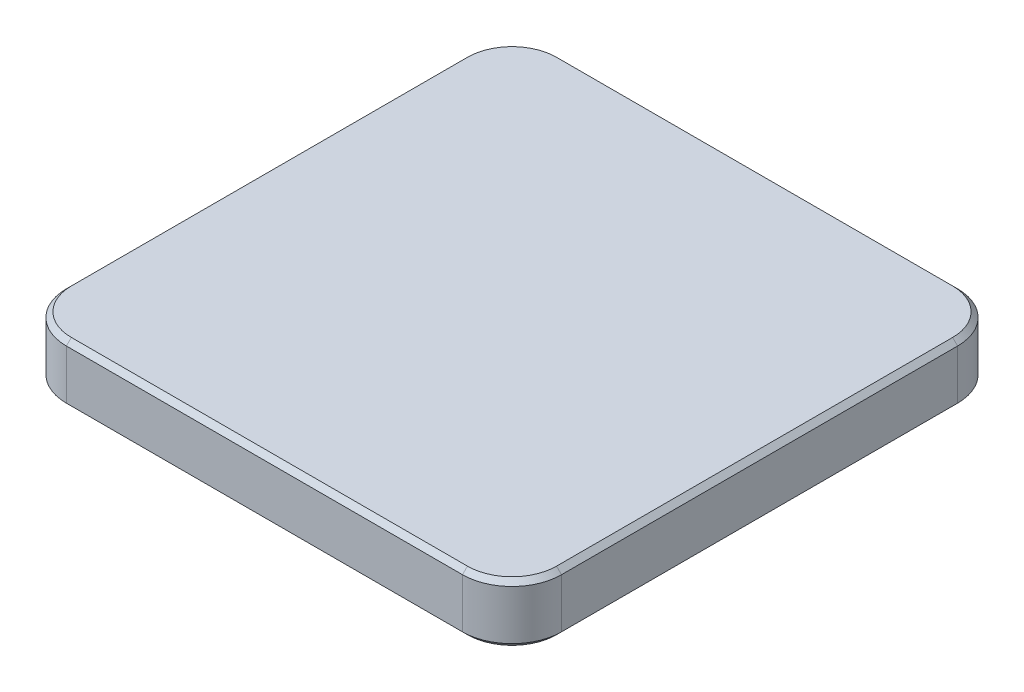
ISO-10303-21;
HEADER;
FILE_DESCRIPTION(('STEP AP214'),'2;1');
FILE_NAME('part.step','',(''),(''),'','','');
FILE_SCHEMA(('AUTOMOTIVE_DESIGN { 1 0 10303 214 1 1 1 1 }'));
ENDSEC;
DATA;
#1=APPLICATION_CONTEXT('core data for automotive mechanical design processes');
#2=APPLICATION_PROTOCOL_DEFINITION('international standard','automotive_design',2000,#1);
#3=PRODUCT_CONTEXT('',#1,'mechanical');
#4=PRODUCT('Part','Part','',(#3));
#5=PRODUCT_RELATED_PRODUCT_CATEGORY('part','',(#4));
#6=PRODUCT_DEFINITION_FORMATION('','',#4);
#7=PRODUCT_DEFINITION_CONTEXT('part definition',#1,'design');
#8=PRODUCT_DEFINITION('design','',#6,#7);
#9=PRODUCT_DEFINITION_SHAPE('','',#8);
#10=(LENGTH_UNIT() NAMED_UNIT(*) SI_UNIT(.MILLI.,.METRE.));
#11=(NAMED_UNIT(*) PLANE_ANGLE_UNIT() SI_UNIT($,.RADIAN.));
#12=(NAMED_UNIT(*) SI_UNIT($,.STERADIAN.) SOLID_ANGLE_UNIT());
#13=UNCERTAINTY_MEASURE_WITH_UNIT(LENGTH_MEASURE(1.E-05),#10,'distance_accuracy_value','');
#14=(GEOMETRIC_REPRESENTATION_CONTEXT(3) GLOBAL_UNCERTAINTY_ASSIGNED_CONTEXT((#13)) GLOBAL_UNIT_ASSIGNED_CONTEXT((#10,
#11,#12)) REPRESENTATION_CONTEXT('',''));
#15=CARTESIAN_POINT('',(0.,0.,0.));
#16=DIRECTION('',(0.,0.,1.));
#17=DIRECTION('',(1.,0.,0.));
#18=AXIS2_PLACEMENT_3D('',#15,#16,#17);
#19=CARTESIAN_POINT('',(-50.,12.,50.));
#20=DIRECTION('',(1.,0.,0.));
#21=DIRECTION('',(0.,0.,-1.));
#22=AXIS2_PLACEMENT_3D('',#19,#20,#21);
#23=PLANE('',#22);
#24=DIRECTION('',(0.,-1.,0.));
#25=VECTOR('',#24,1.);
#26=CARTESIAN_POINT('',(-50.,12.,40.));
#27=LINE('',#26,#25);
#28=CARTESIAN_POINT('',(-50.,1.,40.));
#29=VERTEX_POINT('',#28);
#30=CARTESIAN_POINT('',(-50.,11.,40.));
#31=VERTEX_POINT('',#30);
#32=EDGE_CURVE('E283',#29,#31,#27,.F.);
#33=ORIENTED_EDGE('',*,*,#32,.T.);
#34=DIRECTION('',(0.,0.,-1.));
#35=VECTOR('',#34,1.);
#36=CARTESIAN_POINT('',(-50.,11.,50.));
#37=LINE('',#36,#35);
#38=CARTESIAN_POINT('',(-50.,11.,-40.));
#39=VERTEX_POINT('',#38);
#40=EDGE_CURVE('E191',#31,#39,#37,.T.);
#41=ORIENTED_EDGE('',*,*,#40,.T.);
#42=DIRECTION('',(0.,-1.,0.));
#43=VECTOR('',#42,1.);
#44=CARTESIAN_POINT('',(-50.,12.,-40.));
#45=LINE('',#44,#43);
#46=CARTESIAN_POINT('',(-50.,1.,-40.));
#47=VERTEX_POINT('',#46);
#48=EDGE_CURVE('E275',#39,#47,#45,.T.);
#49=ORIENTED_EDGE('',*,*,#48,.T.);
#50=DIRECTION('',(0.,0.,1.));
#51=VECTOR('',#50,1.);
#52=CARTESIAN_POINT('',(-50.,1.,40.));
#53=LINE('',#52,#51);
#54=EDGE_CURVE('E189',#47,#29,#53,.T.);
#55=ORIENTED_EDGE('',*,*,#54,.T.);
#56=EDGE_LOOP('',(#33,#41,#49,#55));
#57=FACE_BOUND('',#56,.T.);
#58=ADVANCED_FACE('F33',(#57),#23,.F.);
#59=CARTESIAN_POINT('',(50.,12.,50.));
#60=DIRECTION('',(0.,0.,-1.));
#61=DIRECTION('',(-1.,0.,0.));
#62=AXIS2_PLACEMENT_3D('',#59,#60,#61);
#63=PLANE('',#62);
#64=DIRECTION('',(0.,-1.,0.));
#65=VECTOR('',#64,1.);
#66=CARTESIAN_POINT('',(40.,12.,50.));
#67=LINE('',#66,#65);
#68=CARTESIAN_POINT('',(40.,1.,50.));
#69=VERTEX_POINT('',#68);
#70=CARTESIAN_POINT('',(40.,11.,50.));
#71=VERTEX_POINT('',#70);
#72=EDGE_CURVE('E238',#69,#71,#67,.F.);
#73=ORIENTED_EDGE('',*,*,#72,.T.);
#74=DIRECTION('',(-1.,0.,0.));
#75=VECTOR('',#74,1.);
#76=CARTESIAN_POINT('',(50.,11.,50.));
#77=LINE('',#76,#75);
#78=CARTESIAN_POINT('',(-40.,11.,50.));
#79=VERTEX_POINT('',#78);
#80=EDGE_CURVE('E183',#71,#79,#77,.T.);
#81=ORIENTED_EDGE('',*,*,#80,.T.);
#82=DIRECTION('',(0.,-1.,0.));
#83=VECTOR('',#82,1.);
#84=CARTESIAN_POINT('',(-40.,12.,50.));
#85=LINE('',#84,#83);
#86=CARTESIAN_POINT('',(-40.,1.,50.));
#87=VERTEX_POINT('',#86);
#88=EDGE_CURVE('E284',#79,#87,#85,.T.);
#89=ORIENTED_EDGE('',*,*,#88,.T.);
#90=DIRECTION('',(1.,0.,0.));
#91=VECTOR('',#90,1.);
#92=CARTESIAN_POINT('',(40.,1.,50.));
#93=LINE('',#92,#91);
#94=EDGE_CURVE('E181',#87,#69,#93,.T.);
#95=ORIENTED_EDGE('',*,*,#94,.T.);
#96=EDGE_LOOP('',(#73,#81,#89,#95));
#97=FACE_BOUND('',#96,.T.);
#98=ADVANCED_FACE('F324',(#97),#63,.F.);
#99=CARTESIAN_POINT('',(50.,12.,-50.));
#100=DIRECTION('',(-1.,0.,0.));
#101=DIRECTION('',(0.,0.,1.));
#102=AXIS2_PLACEMENT_3D('',#99,#100,#101);
#103=PLANE('',#102);
#104=DIRECTION('',(0.,-1.,0.));
#105=VECTOR('',#104,1.);
#106=CARTESIAN_POINT('',(50.,12.,-40.));
#107=LINE('',#106,#105);
#108=CARTESIAN_POINT('',(50.,1.,-40.));
#109=VERTEX_POINT('',#108);
#110=CARTESIAN_POINT('',(50.,11.,-40.));
#111=VERTEX_POINT('',#110);
#112=EDGE_CURVE('E166',#109,#111,#107,.F.);
#113=ORIENTED_EDGE('',*,*,#112,.T.);
#114=DIRECTION('',(0.,0.,1.));
#115=VECTOR('',#114,1.);
#116=CARTESIAN_POINT('',(50.,11.,-50.));
#117=LINE('',#116,#115);
#118=CARTESIAN_POINT('',(50.,11.,40.));
#119=VERTEX_POINT('',#118);
#120=EDGE_CURVE('E207',#111,#119,#117,.T.);
#121=ORIENTED_EDGE('',*,*,#120,.T.);
#122=DIRECTION('',(0.,-1.,0.));
#123=VECTOR('',#122,1.);
#124=CARTESIAN_POINT('',(50.,12.,40.));
#125=LINE('',#124,#123);
#126=CARTESIAN_POINT('',(50.,1.,40.));
#127=VERTEX_POINT('',#126);
#128=EDGE_CURVE('E295',#119,#127,#125,.T.);
#129=ORIENTED_EDGE('',*,*,#128,.T.);
#130=DIRECTION('',(0.,0.,-1.));
#131=VECTOR('',#130,1.);
#132=CARTESIAN_POINT('',(50.,1.,-40.));
#133=LINE('',#132,#131);
#134=EDGE_CURVE('E205',#127,#109,#133,.T.);
#135=ORIENTED_EDGE('',*,*,#134,.T.);
#136=EDGE_LOOP('',(#113,#121,#129,#135));
#137=FACE_BOUND('',#136,.T.);
#138=ADVANCED_FACE('F336',(#137),#103,.F.);
#139=CARTESIAN_POINT('',(-50.,12.,-50.));
#140=DIRECTION('',(0.,0.,1.));
#141=DIRECTION('',(1.,0.,0.));
#142=AXIS2_PLACEMENT_3D('',#139,#140,#141);
#143=PLANE('',#142);
#144=DIRECTION('',(0.,-1.,0.));
#145=VECTOR('',#144,1.);
#146=CARTESIAN_POINT('',(-40.,12.,-50.));
#147=LINE('',#146,#145);
#148=CARTESIAN_POINT('',(-40.,1.,-50.));
#149=VERTEX_POINT('',#148);
#150=CARTESIAN_POINT('',(-40.,11.,-50.));
#151=VERTEX_POINT('',#150);
#152=EDGE_CURVE('E278',#149,#151,#147,.F.);
#153=ORIENTED_EDGE('',*,*,#152,.T.);
#154=DIRECTION('',(1.,0.,0.));
#155=VECTOR('',#154,1.);
#156=CARTESIAN_POINT('',(-50.,11.,-50.));
#157=LINE('',#156,#155);
#158=CARTESIAN_POINT('',(40.,11.,-50.));
#159=VERTEX_POINT('',#158);
#160=EDGE_CURVE('E199',#151,#159,#157,.T.);
#161=ORIENTED_EDGE('',*,*,#160,.T.);
#162=DIRECTION('',(0.,-1.,0.));
#163=VECTOR('',#162,1.);
#164=CARTESIAN_POINT('',(40.,12.,-50.));
#165=LINE('',#164,#163);
#166=CARTESIAN_POINT('',(40.,1.,-50.));
#167=VERTEX_POINT('',#166);
#168=EDGE_CURVE('E292',#159,#167,#165,.T.);
#169=ORIENTED_EDGE('',*,*,#168,.T.);
#170=DIRECTION('',(-1.,0.,0.));
#171=VECTOR('',#170,1.);
#172=CARTESIAN_POINT('',(-40.,1.,-50.));
#173=LINE('',#172,#171);
#174=EDGE_CURVE('E197',#167,#149,#173,.T.);
#175=ORIENTED_EDGE('',*,*,#174,.T.);
#176=EDGE_LOOP('',(#153,#161,#169,#175));
#177=FACE_BOUND('',#176,.T.);
#178=ADVANCED_FACE('F539',(#177),#143,.F.);
#179=CARTESIAN_POINT('',(0.,12.,0.));
#180=DIRECTION('',(0.,-1.,0.));
#181=DIRECTION('',(0.,0.,-1.));
#182=AXIS2_PLACEMENT_3D('',#179,#180,#181);
#183=PLANE('',#182);
#184=DIRECTION('',(1.,0.,0.));
#185=VECTOR('',#184,1.);
#186=CARTESIAN_POINT('',(0.,12.,49.));
#187=LINE('',#186,#185);
#188=CARTESIAN_POINT('',(-40.,12.,49.));
#189=VERTEX_POINT('',#188);
#190=CARTESIAN_POINT('',(40.,12.,49.));
#191=VERTEX_POINT('',#190);
#192=EDGE_CURVE('E170',#189,#191,#187,.T.);
#193=ORIENTED_EDGE('',*,*,#192,.T.);
#194=CARTESIAN_POINT('',(40.,12.,40.));
#195=DIRECTION('',(0.,-1.,0.));
#196=DIRECTION('',(0.,0.,-1.));
#197=AXIS2_PLACEMENT_3D('',#194,#195,#196);
#198=CIRCLE('',#197,9.00000000000003);
#199=CARTESIAN_POINT('',(49.,12.,40.));
#200=VERTEX_POINT('',#199);
#201=EDGE_CURVE('E151',#191,#200,#198,.F.);
#202=ORIENTED_EDGE('',*,*,#201,.T.);
#203=DIRECTION('',(0.,0.,-1.));
#204=VECTOR('',#203,1.);
#205=CARTESIAN_POINT('',(49.,12.,0.));
#206=LINE('',#205,#204);
#207=CARTESIAN_POINT('',(49.,12.,-40.));
#208=VERTEX_POINT('',#207);
#209=EDGE_CURVE('E159',#200,#208,#206,.T.);
#210=ORIENTED_EDGE('',*,*,#209,.T.);
#211=CARTESIAN_POINT('',(40.,12.,-40.));
#212=DIRECTION('',(0.,-1.,0.));
#213=DIRECTION('',(0.,0.,-1.));
#214=AXIS2_PLACEMENT_3D('',#211,#212,#213);
#215=CIRCLE('',#214,9.00000000000003);
#216=CARTESIAN_POINT('',(40.,12.,-49.));
#217=VERTEX_POINT('',#216);
#218=EDGE_CURVE('E165',#208,#217,#215,.F.);
#219=ORIENTED_EDGE('',*,*,#218,.T.);
#220=DIRECTION('',(-1.,0.,0.));
#221=VECTOR('',#220,1.);
#222=CARTESIAN_POINT('',(0.,12.,-49.));
#223=LINE('',#222,#221);
#224=CARTESIAN_POINT('',(-40.,12.,-49.));
#225=VERTEX_POINT('',#224);
#226=EDGE_CURVE('E301',#217,#225,#223,.T.);
#227=ORIENTED_EDGE('',*,*,#226,.T.);
#228=CARTESIAN_POINT('',(-40.,12.,-40.));
#229=DIRECTION('',(0.,-1.,0.));
#230=DIRECTION('',(0.,0.,-1.));
#231=AXIS2_PLACEMENT_3D('',#228,#229,#230);
#232=CIRCLE('',#231,9.00000000000003);
#233=CARTESIAN_POINT('',(-49.,12.,-40.));
#234=VERTEX_POINT('',#233);
#235=EDGE_CURVE('E303',#225,#234,#232,.F.);
#236=ORIENTED_EDGE('',*,*,#235,.T.);
#237=DIRECTION('',(0.,0.,1.));
#238=VECTOR('',#237,1.);
#239=CARTESIAN_POINT('',(-49.,12.,0.));
#240=LINE('',#239,#238);
#241=CARTESIAN_POINT('',(-49.,12.,40.));
#242=VERTEX_POINT('',#241);
#243=EDGE_CURVE('E305',#234,#242,#240,.T.);
#244=ORIENTED_EDGE('',*,*,#243,.T.);
#245=CARTESIAN_POINT('',(-40.,12.,40.));
#246=DIRECTION('',(0.,-1.,0.));
#247=DIRECTION('',(0.,0.,-1.));
#248=AXIS2_PLACEMENT_3D('',#245,#246,#247);
#249=CIRCLE('',#248,9.00000000000003);
#250=EDGE_CURVE('E176',#242,#189,#249,.F.);
#251=ORIENTED_EDGE('',*,*,#250,.T.);
#252=EDGE_LOOP('',(#193,#202,#210,#219,#227,#236,#244,#251));
#253=FACE_BOUND('',#252,.T.);
#254=ADVANCED_FACE('F168',(#253),#183,.F.);
#255=CARTESIAN_POINT('',(0.,0.,0.));
#256=DIRECTION('',(0.,-1.,0.));
#257=DIRECTION('',(0.,0.,-1.));
#258=AXIS2_PLACEMENT_3D('',#255,#256,#257);
#259=PLANE('',#258);
#260=DIRECTION('',(0.,0.,1.));
#261=VECTOR('',#260,1.);
#262=CARTESIAN_POINT('',(49.,0.,40.));
#263=LINE('',#262,#261);
#264=CARTESIAN_POINT('',(49.,0.,-40.));
#265=VERTEX_POINT('',#264);
#266=CARTESIAN_POINT('',(49.,0.,40.));
#267=VERTEX_POINT('',#266);
#268=EDGE_CURVE('E42',#265,#267,#263,.T.);
#269=ORIENTED_EDGE('',*,*,#268,.T.);
#270=CARTESIAN_POINT('',(40.,0.,40.));
#271=DIRECTION('',(0.,-1.,0.));
#272=DIRECTION('',(0.,0.,-1.));
#273=AXIS2_PLACEMENT_3D('',#270,#271,#272);
#274=CIRCLE('',#273,9.);
#275=CARTESIAN_POINT('',(40.,0.,49.));
#276=VERTEX_POINT('',#275);
#277=EDGE_CURVE('E11',#267,#276,#274,.T.);
#278=ORIENTED_EDGE('',*,*,#277,.T.);
#279=DIRECTION('',(-1.,0.,0.));
#280=VECTOR('',#279,1.);
#281=CARTESIAN_POINT('',(-40.,0.,49.));
#282=LINE('',#281,#280);
#283=CARTESIAN_POINT('',(-40.,0.,49.));
#284=VERTEX_POINT('',#283);
#285=EDGE_CURVE('E209',#276,#284,#282,.T.);
#286=ORIENTED_EDGE('',*,*,#285,.T.);
#287=CARTESIAN_POINT('',(-40.,0.,40.));
#288=DIRECTION('',(0.,-1.,0.));
#289=DIRECTION('',(0.,0.,-1.));
#290=AXIS2_PLACEMENT_3D('',#287,#288,#289);
#291=CIRCLE('',#290,9.);
#292=CARTESIAN_POINT('',(-49.,0.,40.));
#293=VERTEX_POINT('',#292);
#294=EDGE_CURVE('E211',#284,#293,#291,.T.);
#295=ORIENTED_EDGE('',*,*,#294,.T.);
#296=DIRECTION('',(0.,0.,-1.));
#297=VECTOR('',#296,1.);
#298=CARTESIAN_POINT('',(-49.,0.,-40.));
#299=LINE('',#298,#297);
#300=CARTESIAN_POINT('',(-49.,0.,-40.));
#301=VERTEX_POINT('',#300);
#302=EDGE_CURVE('E213',#293,#301,#299,.T.);
#303=ORIENTED_EDGE('',*,*,#302,.T.);
#304=CARTESIAN_POINT('',(-40.,0.,-40.));
#305=DIRECTION('',(0.,-1.,0.));
#306=DIRECTION('',(0.,0.,-1.));
#307=AXIS2_PLACEMENT_3D('',#304,#305,#306);
#308=CIRCLE('',#307,9.);
#309=CARTESIAN_POINT('',(-40.,0.,-49.));
#310=VERTEX_POINT('',#309);
#311=EDGE_CURVE('E215',#301,#310,#308,.T.);
#312=ORIENTED_EDGE('',*,*,#311,.T.);
#313=DIRECTION('',(1.,0.,0.));
#314=VECTOR('',#313,1.);
#315=CARTESIAN_POINT('',(40.,0.,-49.));
#316=LINE('',#315,#314);
#317=CARTESIAN_POINT('',(40.,0.,-49.));
#318=VERTEX_POINT('',#317);
#319=EDGE_CURVE('E217',#310,#318,#316,.T.);
#320=ORIENTED_EDGE('',*,*,#319,.T.);
#321=CARTESIAN_POINT('',(40.,0.,-40.));
#322=DIRECTION('',(0.,-1.,0.));
#323=DIRECTION('',(0.,0.,-1.));
#324=AXIS2_PLACEMENT_3D('',#321,#322,#323);
#325=CIRCLE('',#324,9.);
#326=EDGE_CURVE('E53',#318,#265,#325,.T.);
#327=ORIENTED_EDGE('',*,*,#326,.T.);
#328=EDGE_LOOP('',(#269,#278,#286,#295,#303,#312,#320,#327));
#329=FACE_BOUND('',#328,.T.);
#330=ADVANCED_FACE('F375',(#329),#259,.T.);
#331=CARTESIAN_POINT('',(-40.,12.,40.));
#332=DIRECTION('',(0.,-1.,0.));
#333=DIRECTION('',(0.,0.,-1.));
#334=AXIS2_PLACEMENT_3D('',#331,#332,#333);
#335=CYLINDRICAL_SURFACE('',#334,10.);
#336=ORIENTED_EDGE('',*,*,#88,.F.);
#337=CARTESIAN_POINT('',(-40.,11.,40.));
#338=DIRECTION('',(0.,-1.,0.));
#339=DIRECTION('',(0.,0.,-1.));
#340=AXIS2_PLACEMENT_3D('',#337,#338,#339);
#341=CIRCLE('',#340,10.);
#342=EDGE_CURVE('E187',#79,#31,#341,.T.);
#343=ORIENTED_EDGE('',*,*,#342,.T.);
#344=ORIENTED_EDGE('',*,*,#32,.F.);
#345=CARTESIAN_POINT('',(-40.,1.,40.));
#346=DIRECTION('',(0.,-1.,0.));
#347=DIRECTION('',(0.,0.,-1.));
#348=AXIS2_PLACEMENT_3D('',#345,#346,#347);
#349=CIRCLE('',#348,10.);
#350=EDGE_CURVE('E185',#29,#87,#349,.F.);
#351=ORIENTED_EDGE('',*,*,#350,.T.);
#352=EDGE_LOOP('',(#336,#343,#344,#351));
#353=FACE_BOUND('',#352,.T.);
#354=ADVANCED_FACE('F371',(#353),#335,.T.);
#355=CARTESIAN_POINT('',(40.,12.,-40.));
#356=DIRECTION('',(0.,-1.,0.));
#357=DIRECTION('',(0.,0.,-1.));
#358=AXIS2_PLACEMENT_3D('',#355,#356,#357);
#359=CYLINDRICAL_SURFACE('',#358,10.);
#360=ORIENTED_EDGE('',*,*,#168,.F.);
#361=CARTESIAN_POINT('',(40.,11.,-40.));
#362=DIRECTION('',(0.,-1.,0.));
#363=DIRECTION('',(0.,0.,-1.));
#364=AXIS2_PLACEMENT_3D('',#361,#362,#363);
#365=CIRCLE('',#364,10.);
#366=EDGE_CURVE('E203',#159,#111,#365,.T.);
#367=ORIENTED_EDGE('',*,*,#366,.T.);
#368=ORIENTED_EDGE('',*,*,#112,.F.);
#369=CARTESIAN_POINT('',(40.,1.,-40.));
#370=DIRECTION('',(0.,-1.,0.));
#371=DIRECTION('',(0.,0.,-1.));
#372=AXIS2_PLACEMENT_3D('',#369,#370,#371);
#373=CIRCLE('',#372,10.);
#374=EDGE_CURVE('E201',#109,#167,#373,.F.);
#375=ORIENTED_EDGE('',*,*,#374,.T.);
#376=EDGE_LOOP('',(#360,#367,#368,#375));
#377=FACE_BOUND('',#376,.T.);
#378=ADVANCED_FACE('F374',(#377),#359,.T.);
#379=CARTESIAN_POINT('',(-40.,12.,-40.));
#380=DIRECTION('',(0.,-1.,0.));
#381=DIRECTION('',(0.,0.,-1.));
#382=AXIS2_PLACEMENT_3D('',#379,#380,#381);
#383=CYLINDRICAL_SURFACE('',#382,10.);
#384=ORIENTED_EDGE('',*,*,#48,.F.);
#385=CARTESIAN_POINT('',(-40.,11.,-40.));
#386=DIRECTION('',(0.,-1.,0.));
#387=DIRECTION('',(0.,0.,-1.));
#388=AXIS2_PLACEMENT_3D('',#385,#386,#387);
#389=CIRCLE('',#388,10.);
#390=EDGE_CURVE('E195',#39,#151,#389,.T.);
#391=ORIENTED_EDGE('',*,*,#390,.T.);
#392=ORIENTED_EDGE('',*,*,#152,.F.);
#393=CARTESIAN_POINT('',(-40.,1.,-40.));
#394=DIRECTION('',(0.,-1.,0.));
#395=DIRECTION('',(0.,0.,-1.));
#396=AXIS2_PLACEMENT_3D('',#393,#394,#395);
#397=CIRCLE('',#396,10.);
#398=EDGE_CURVE('E193',#149,#47,#397,.F.);
#399=ORIENTED_EDGE('',*,*,#398,.T.);
#400=EDGE_LOOP('',(#384,#391,#392,#399));
#401=FACE_BOUND('',#400,.T.);
#402=ADVANCED_FACE('F274',(#401),#383,.T.);
#403=CARTESIAN_POINT('',(40.,12.,40.));
#404=DIRECTION('',(0.,-1.,0.));
#405=DIRECTION('',(0.,0.,-1.));
#406=AXIS2_PLACEMENT_3D('',#403,#404,#405);
#407=CYLINDRICAL_SURFACE('',#406,10.);
#408=ORIENTED_EDGE('',*,*,#128,.F.);
#409=CARTESIAN_POINT('',(40.,11.,40.));
#410=DIRECTION('',(0.,-1.,0.));
#411=DIRECTION('',(0.,0.,-1.));
#412=AXIS2_PLACEMENT_3D('',#409,#410,#411);
#413=CIRCLE('',#412,10.);
#414=EDGE_CURVE('E153',#119,#71,#413,.T.);
#415=ORIENTED_EDGE('',*,*,#414,.T.);
#416=ORIENTED_EDGE('',*,*,#72,.F.);
#417=CARTESIAN_POINT('',(40.,1.,40.));
#418=DIRECTION('',(0.,-1.,0.));
#419=DIRECTION('',(0.,0.,-1.));
#420=AXIS2_PLACEMENT_3D('',#417,#418,#419);
#421=CIRCLE('',#420,10.);
#422=EDGE_CURVE('E172',#69,#127,#421,.F.);
#423=ORIENTED_EDGE('',*,*,#422,.T.);
#424=EDGE_LOOP('',(#408,#415,#416,#423));
#425=FACE_BOUND('',#424,.T.);
#426=ADVANCED_FACE('F322',(#425),#407,.T.);
#427=CARTESIAN_POINT('',(-40.,12.,-40.));
#428=DIRECTION('',(0.,-1.,0.));
#429=DIRECTION('',(0.,0.,-1.));
#430=AXIS2_PLACEMENT_3D('',#427,#428,#429);
#431=CONICAL_SURFACE('',#430,9.00000000000003,0.785398163397447);
#432=DIRECTION('',(0.,0.707106781186548,0.707106781186548));
#433=VECTOR('',#432,1.);
#434=CARTESIAN_POINT('',(-40.,11.,-50.));
#435=LINE('',#434,#433);
#436=EDGE_CURVE('E232',#151,#225,#435,.T.);
#437=ORIENTED_EDGE('',*,*,#436,.F.);
#438=ORIENTED_EDGE('',*,*,#390,.F.);
#439=DIRECTION('',(-0.707106781186548,-0.707106781186548,0.));
#440=VECTOR('',#439,1.);
#441=CARTESIAN_POINT('',(-49.,12.,-40.));
#442=LINE('',#441,#440);
#443=EDGE_CURVE('E235',#234,#39,#442,.T.);
#444=ORIENTED_EDGE('',*,*,#443,.F.);
#445=ORIENTED_EDGE('',*,*,#235,.F.);
#446=EDGE_LOOP('',(#437,#438,#444,#445));
#447=FACE_BOUND('',#446,.T.);
#448=ADVANCED_FACE('F351',(#447),#431,.T.);
#449=CARTESIAN_POINT('',(-49.,12.,0.));
#450=DIRECTION('',(0.707106781186548,-0.707106781186548,0.));
#451=DIRECTION('',(0.,0.,1.));
#452=AXIS2_PLACEMENT_3D('',#449,#450,#451);
#453=PLANE('',#452);
#454=ORIENTED_EDGE('',*,*,#443,.T.);
#455=ORIENTED_EDGE('',*,*,#40,.F.);
#456=DIRECTION('',(-0.707106781186548,-0.707106781186548,0.));
#457=VECTOR('',#456,1.);
#458=CARTESIAN_POINT('',(-49.,12.,40.));
#459=LINE('',#458,#457);
#460=EDGE_CURVE('E229',#242,#31,#459,.T.);
#461=ORIENTED_EDGE('',*,*,#460,.F.);
#462=ORIENTED_EDGE('',*,*,#243,.F.);
#463=EDGE_LOOP('',(#454,#455,#461,#462));
#464=FACE_BOUND('',#463,.T.);
#465=ADVANCED_FACE('F354',(#464),#453,.F.);
#466=CARTESIAN_POINT('',(0.,12.,-49.));
#467=DIRECTION('',(0.,-0.707106781186548,0.707106781186548));
#468=DIRECTION('',(-1.,0.,0.));
#469=AXIS2_PLACEMENT_3D('',#466,#467,#468);
#470=PLANE('',#469);
#471=ORIENTED_EDGE('',*,*,#436,.T.);
#472=ORIENTED_EDGE('',*,*,#226,.F.);
#473=DIRECTION('',(0.,0.707106781186548,0.707106781186548));
#474=VECTOR('',#473,1.);
#475=CARTESIAN_POINT('',(40.,11.,-50.));
#476=LINE('',#475,#474);
#477=EDGE_CURVE('E226',#159,#217,#476,.T.);
#478=ORIENTED_EDGE('',*,*,#477,.F.);
#479=ORIENTED_EDGE('',*,*,#160,.F.);
#480=EDGE_LOOP('',(#471,#472,#478,#479));
#481=FACE_BOUND('',#480,.T.);
#482=ADVANCED_FACE('F347',(#481),#470,.F.);
#483=CARTESIAN_POINT('',(-40.,12.,40.));
#484=DIRECTION('',(0.,-1.,0.));
#485=DIRECTION('',(0.,0.,-1.));
#486=AXIS2_PLACEMENT_3D('',#483,#484,#485);
#487=CONICAL_SURFACE('',#486,9.00000000000003,0.785398163397447);
#488=ORIENTED_EDGE('',*,*,#460,.T.);
#489=ORIENTED_EDGE('',*,*,#342,.F.);
#490=DIRECTION('',(0.,-0.707106781186548,0.707106781186548));
#491=VECTOR('',#490,1.);
#492=CARTESIAN_POINT('',(-40.,12.,49.));
#493=LINE('',#492,#491);
#494=EDGE_CURVE('E223',#189,#79,#493,.T.);
#495=ORIENTED_EDGE('',*,*,#494,.F.);
#496=ORIENTED_EDGE('',*,*,#250,.F.);
#497=EDGE_LOOP('',(#488,#489,#495,#496));
#498=FACE_BOUND('',#497,.T.);
#499=ADVANCED_FACE('F312',(#498),#487,.T.);
#500=CARTESIAN_POINT('',(40.,12.,-40.));
#501=DIRECTION('',(0.,-1.,0.));
#502=DIRECTION('',(0.,0.,-1.));
#503=AXIS2_PLACEMENT_3D('',#500,#501,#502);
#504=CONICAL_SURFACE('',#503,9.00000000000003,0.785398163397447);
#505=ORIENTED_EDGE('',*,*,#477,.T.);
#506=ORIENTED_EDGE('',*,*,#218,.F.);
#507=DIRECTION('',(-0.707106781186548,0.707106781186548,0.));
#508=VECTOR('',#507,1.);
#509=CARTESIAN_POINT('',(50.,11.,-40.));
#510=LINE('',#509,#508);
#511=EDGE_CURVE('E162',#111,#208,#510,.T.);
#512=ORIENTED_EDGE('',*,*,#511,.F.);
#513=ORIENTED_EDGE('',*,*,#366,.F.);
#514=EDGE_LOOP('',(#505,#506,#512,#513));
#515=FACE_BOUND('',#514,.T.);
#516=ADVANCED_FACE('F342',(#515),#504,.T.);
#517=CARTESIAN_POINT('',(0.,12.,49.));
#518=DIRECTION('',(0.,-0.707106781186548,-0.707106781186548));
#519=DIRECTION('',(1.,0.,0.));
#520=AXIS2_PLACEMENT_3D('',#517,#518,#519);
#521=PLANE('',#520);
#522=ORIENTED_EDGE('',*,*,#494,.T.);
#523=ORIENTED_EDGE('',*,*,#80,.F.);
#524=DIRECTION('',(0.,-0.707106781186548,0.707106781186548));
#525=VECTOR('',#524,1.);
#526=CARTESIAN_POINT('',(40.,12.,49.));
#527=LINE('',#526,#525);
#528=EDGE_CURVE('E156',#191,#71,#527,.T.);
#529=ORIENTED_EDGE('',*,*,#528,.F.);
#530=ORIENTED_EDGE('',*,*,#192,.F.);
#531=EDGE_LOOP('',(#522,#523,#529,#530));
#532=FACE_BOUND('',#531,.T.);
#533=ADVANCED_FACE('F315',(#532),#521,.F.);
#534=CARTESIAN_POINT('',(49.,12.,0.));
#535=DIRECTION('',(-0.707106781186548,-0.707106781186548,0.));
#536=DIRECTION('',(0.,0.,-1.));
#537=AXIS2_PLACEMENT_3D('',#534,#535,#536);
#538=PLANE('',#537);
#539=ORIENTED_EDGE('',*,*,#511,.T.);
#540=ORIENTED_EDGE('',*,*,#209,.F.);
#541=DIRECTION('',(-0.707106781186548,0.707106781186548,0.));
#542=VECTOR('',#541,1.);
#543=CARTESIAN_POINT('',(50.,11.,40.));
#544=LINE('',#543,#542);
#545=EDGE_CURVE('E147',#119,#200,#544,.T.);
#546=ORIENTED_EDGE('',*,*,#545,.F.);
#547=ORIENTED_EDGE('',*,*,#120,.F.);
#548=EDGE_LOOP('',(#539,#540,#546,#547));
#549=FACE_BOUND('',#548,.T.);
#550=ADVANCED_FACE('F160',(#549),#538,.F.);
#551=CARTESIAN_POINT('',(40.,12.,40.));
#552=DIRECTION('',(0.,-1.,0.));
#553=DIRECTION('',(0.,0.,-1.));
#554=AXIS2_PLACEMENT_3D('',#551,#552,#553);
#555=CONICAL_SURFACE('',#554,9.00000000000003,0.785398163397447);
#556=ORIENTED_EDGE('',*,*,#528,.T.);
#557=ORIENTED_EDGE('',*,*,#414,.F.);
#558=ORIENTED_EDGE('',*,*,#545,.T.);
#559=ORIENTED_EDGE('',*,*,#201,.F.);
#560=EDGE_LOOP('',(#556,#557,#558,#559));
#561=FACE_BOUND('',#560,.T.);
#562=ADVANCED_FACE('F149',(#561),#555,.T.);
#563=CARTESIAN_POINT('',(-40.,0.,-40.));
#564=DIRECTION('',(0.,1.,0.));
#565=DIRECTION('',(0.,0.,1.));
#566=AXIS2_PLACEMENT_3D('',#563,#564,#565);
#567=CONICAL_SURFACE('',#566,9.,0.785398163397447);
#568=DIRECTION('',(0.707106781186547,-0.707106781186547,0.));
#569=VECTOR('',#568,1.);
#570=CARTESIAN_POINT('',(-50.,1.,-40.));
#571=LINE('',#570,#569);
#572=EDGE_CURVE('E254',#47,#301,#571,.T.);
#573=ORIENTED_EDGE('',*,*,#572,.F.);
#574=ORIENTED_EDGE('',*,*,#398,.F.);
#575=DIRECTION('',(0.,0.707106781186547,-0.707106781186547));
#576=VECTOR('',#575,1.);
#577=CARTESIAN_POINT('',(-40.,0.,-49.));
#578=LINE('',#577,#576);
#579=EDGE_CURVE('E37',#310,#149,#578,.T.);
#580=ORIENTED_EDGE('',*,*,#579,.F.);
#581=ORIENTED_EDGE('',*,*,#311,.F.);
#582=EDGE_LOOP('',(#573,#574,#580,#581));
#583=FACE_BOUND('',#582,.T.);
#584=ADVANCED_FACE('F35',(#583),#567,.T.);
#585=CARTESIAN_POINT('',(-50.,1.,-50.));
#586=DIRECTION('',(0.,-0.707106781186547,-0.707106781186547));
#587=DIRECTION('',(1.,0.,0.));
#588=AXIS2_PLACEMENT_3D('',#585,#586,#587);
#589=PLANE('',#588);
#590=ORIENTED_EDGE('',*,*,#579,.T.);
#591=ORIENTED_EDGE('',*,*,#174,.F.);
#592=DIRECTION('',(0.,0.707106781186547,-0.707106781186547));
#593=VECTOR('',#592,1.);
#594=CARTESIAN_POINT('',(40.,0.,-49.));
#595=LINE('',#594,#593);
#596=EDGE_CURVE('E252',#318,#167,#595,.T.);
#597=ORIENTED_EDGE('',*,*,#596,.F.);
#598=ORIENTED_EDGE('',*,*,#319,.F.);
#599=EDGE_LOOP('',(#590,#591,#597,#598));
#600=FACE_BOUND('',#599,.T.);
#601=ADVANCED_FACE('F265',(#600),#589,.T.);
#602=CARTESIAN_POINT('',(-50.,1.,50.));
#603=DIRECTION('',(-0.707106781186547,-0.707106781186547,0.));
#604=DIRECTION('',(0.,0.,-1.));
#605=AXIS2_PLACEMENT_3D('',#602,#603,#604);
#606=PLANE('',#605);
#607=ORIENTED_EDGE('',*,*,#572,.T.);
#608=ORIENTED_EDGE('',*,*,#302,.F.);
#609=DIRECTION('',(0.707106781186547,-0.707106781186547,0.));
#610=VECTOR('',#609,1.);
#611=CARTESIAN_POINT('',(-50.,1.,40.));
#612=LINE('',#611,#610);
#613=EDGE_CURVE('E249',#29,#293,#612,.T.);
#614=ORIENTED_EDGE('',*,*,#613,.F.);
#615=ORIENTED_EDGE('',*,*,#54,.F.);
#616=EDGE_LOOP('',(#607,#608,#614,#615));
#617=FACE_BOUND('',#616,.T.);
#618=ADVANCED_FACE('F423',(#617),#606,.T.);
#619=CARTESIAN_POINT('',(40.,0.,-40.));
#620=DIRECTION('',(0.,1.,0.));
#621=DIRECTION('',(0.,0.,1.));
#622=AXIS2_PLACEMENT_3D('',#619,#620,#621);
#623=CONICAL_SURFACE('',#622,9.,0.785398163397447);
#624=ORIENTED_EDGE('',*,*,#596,.T.);
#625=ORIENTED_EDGE('',*,*,#374,.F.);
#626=DIRECTION('',(0.707106781186547,0.707106781186547,0.));
#627=VECTOR('',#626,1.);
#628=CARTESIAN_POINT('',(49.,0.,-40.));
#629=LINE('',#628,#627);
#630=EDGE_CURVE('E246',#265,#109,#629,.T.);
#631=ORIENTED_EDGE('',*,*,#630,.F.);
#632=ORIENTED_EDGE('',*,*,#326,.F.);
#633=EDGE_LOOP('',(#624,#625,#631,#632));
#634=FACE_BOUND('',#633,.T.);
#635=ADVANCED_FACE('F429',(#634),#623,.T.);
#636=CARTESIAN_POINT('',(-40.,0.,40.));
#637=DIRECTION('',(0.,1.,0.));
#638=DIRECTION('',(0.,0.,1.));
#639=AXIS2_PLACEMENT_3D('',#636,#637,#638);
#640=CONICAL_SURFACE('',#639,9.,0.785398163397447);
#641=ORIENTED_EDGE('',*,*,#613,.T.);
#642=ORIENTED_EDGE('',*,*,#294,.F.);
#643=DIRECTION('',(0.,-0.707106781186547,-0.707106781186547));
#644=VECTOR('',#643,1.);
#645=CARTESIAN_POINT('',(-40.,1.,50.));
#646=LINE('',#645,#644);
#647=EDGE_CURVE('E243',#87,#284,#646,.T.);
#648=ORIENTED_EDGE('',*,*,#647,.F.);
#649=ORIENTED_EDGE('',*,*,#350,.F.);
#650=EDGE_LOOP('',(#641,#642,#648,#649));
#651=FACE_BOUND('',#650,.T.);
#652=ADVANCED_FACE('F436',(#651),#640,.T.);
#653=CARTESIAN_POINT('',(50.,1.,-50.));
#654=DIRECTION('',(0.707106781186547,-0.707106781186547,0.));
#655=DIRECTION('',(0.,0.,1.));
#656=AXIS2_PLACEMENT_3D('',#653,#654,#655);
#657=PLANE('',#656);
#658=ORIENTED_EDGE('',*,*,#630,.T.);
#659=ORIENTED_EDGE('',*,*,#134,.F.);
#660=DIRECTION('',(0.707106781186547,0.707106781186547,0.));
#661=VECTOR('',#660,1.);
#662=CARTESIAN_POINT('',(49.,0.,40.));
#663=LINE('',#662,#661);
#664=EDGE_CURVE('E241',#267,#127,#663,.T.);
#665=ORIENTED_EDGE('',*,*,#664,.F.);
#666=ORIENTED_EDGE('',*,*,#268,.F.);
#667=EDGE_LOOP('',(#658,#659,#665,#666));
#668=FACE_BOUND('',#667,.T.);
#669=ADVANCED_FACE('F444',(#668),#657,.T.);
#670=CARTESIAN_POINT('',(50.,1.,50.));
#671=DIRECTION('',(0.,-0.707106781186547,0.707106781186547));
#672=DIRECTION('',(-1.,0.,0.));
#673=AXIS2_PLACEMENT_3D('',#670,#671,#672);
#674=PLANE('',#673);
#675=ORIENTED_EDGE('',*,*,#647,.T.);
#676=ORIENTED_EDGE('',*,*,#285,.F.);
#677=DIRECTION('',(0.,-0.707106781186547,-0.707106781186547));
#678=VECTOR('',#677,1.);
#679=CARTESIAN_POINT('',(40.,1.,50.));
#680=LINE('',#679,#678);
#681=EDGE_CURVE('E239',#69,#276,#680,.T.);
#682=ORIENTED_EDGE('',*,*,#681,.F.);
#683=ORIENTED_EDGE('',*,*,#94,.F.);
#684=EDGE_LOOP('',(#675,#676,#682,#683));
#685=FACE_BOUND('',#684,.T.);
#686=ADVANCED_FACE('F329',(#685),#674,.T.);
#687=CARTESIAN_POINT('',(40.,0.,40.));
#688=DIRECTION('',(0.,1.,0.));
#689=DIRECTION('',(0.,0.,1.));
#690=AXIS2_PLACEMENT_3D('',#687,#688,#689);
#691=CONICAL_SURFACE('',#690,9.,0.785398163397447);
#692=ORIENTED_EDGE('',*,*,#664,.T.);
#693=ORIENTED_EDGE('',*,*,#422,.F.);
#694=ORIENTED_EDGE('',*,*,#681,.T.);
#695=ORIENTED_EDGE('',*,*,#277,.F.);
#696=EDGE_LOOP('',(#692,#693,#694,#695));
#697=FACE_BOUND('',#696,.T.);
#698=ADVANCED_FACE('F333',(#697),#691,.T.);
#699=CLOSED_SHELL('',(#58,#98,#138,#178,#254,#330,#354,#378,#402,#426,#448,#465,#482,#499,#516,
#533,#550,#562,#584,#601,#618,#635,#652,#669,#686,#698));
#700=MANIFOLD_SOLID_BREP('B2',#699);
#701=ADVANCED_BREP_SHAPE_REPRESENTATION('',(#18,#700),#14);
#702=SHAPE_DEFINITION_REPRESENTATION(#9,#701);
ENDSEC;
END-ISO-10303-21;
